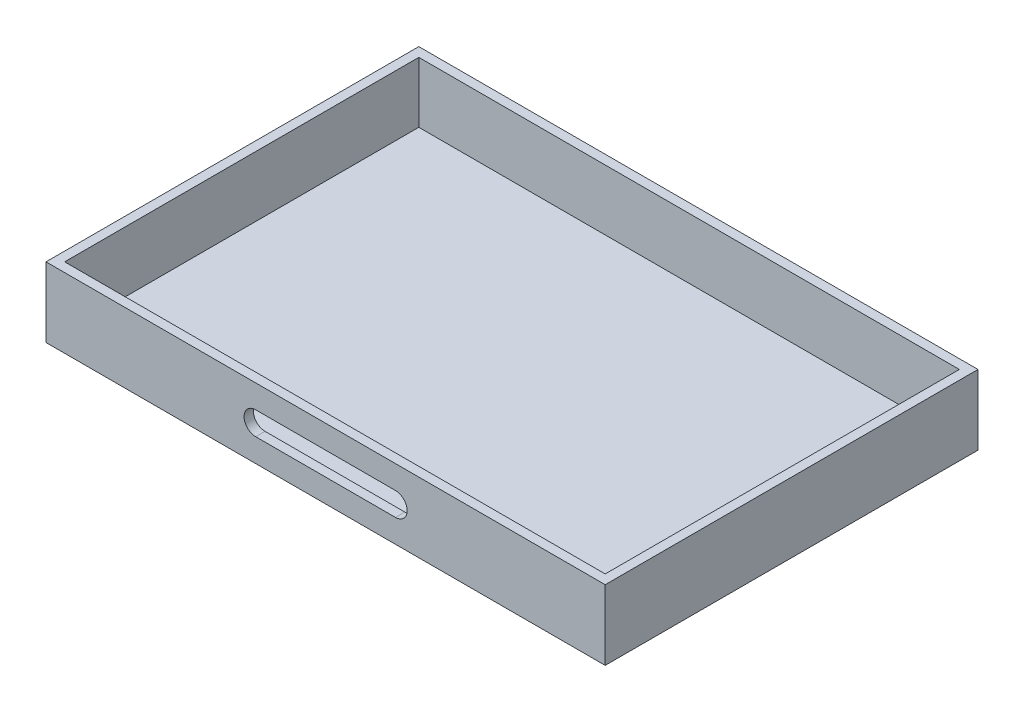
ISO-10303-21;
HEADER;
FILE_DESCRIPTION(('STEP AP214'),'2;1');
FILE_NAME('part.step','',(''),(''),'','','');
FILE_SCHEMA(('AUTOMOTIVE_DESIGN { 1 0 10303 214 1 1 1 1 }'));
ENDSEC;
DATA;
#1=APPLICATION_CONTEXT('core data for automotive mechanical design processes');
#2=APPLICATION_PROTOCOL_DEFINITION('international standard','automotive_design',2000,#1);
#3=PRODUCT_CONTEXT('',#1,'mechanical');
#4=PRODUCT('Part','Part','',(#3));
#5=PRODUCT_RELATED_PRODUCT_CATEGORY('part','',(#4));
#6=PRODUCT_DEFINITION_FORMATION('','',#4);
#7=PRODUCT_DEFINITION_CONTEXT('part definition',#1,'design');
#8=PRODUCT_DEFINITION('design','',#6,#7);
#9=PRODUCT_DEFINITION_SHAPE('','',#8);
#10=(LENGTH_UNIT() NAMED_UNIT(*) SI_UNIT(.MILLI.,.METRE.));
#11=(NAMED_UNIT(*) PLANE_ANGLE_UNIT() SI_UNIT($,.RADIAN.));
#12=(NAMED_UNIT(*) SI_UNIT($,.STERADIAN.) SOLID_ANGLE_UNIT());
#13=UNCERTAINTY_MEASURE_WITH_UNIT(LENGTH_MEASURE(1.E-05),#10,'distance_accuracy_value','');
#14=(GEOMETRIC_REPRESENTATION_CONTEXT(3) GLOBAL_UNCERTAINTY_ASSIGNED_CONTEXT((#13)) GLOBAL_UNIT_ASSIGNED_CONTEXT((#10,
#11,#12)) REPRESENTATION_CONTEXT('',''));
#15=CARTESIAN_POINT('',(0.,0.,0.));
#16=DIRECTION('',(0.,0.,1.));
#17=DIRECTION('',(1.,0.,0.));
#18=AXIS2_PLACEMENT_3D('',#15,#16,#17);
#19=CARTESIAN_POINT('',(60.,2.,40.));
#20=DIRECTION('',(-1.,0.,0.));
#21=DIRECTION('',(0.,0.,1.));
#22=AXIS2_PLACEMENT_3D('',#19,#20,#21);
#23=PLANE('',#22);
#24=DIRECTION('',(0.,0.,-1.));
#25=VECTOR('',#24,1.);
#26=CARTESIAN_POINT('',(60.,0.,40.));
#27=LINE('',#26,#25);
#28=CARTESIAN_POINT('',(60.,0.,40.));
#29=VERTEX_POINT('',#28);
#30=CARTESIAN_POINT('',(60.,0.,-40.));
#31=VERTEX_POINT('',#30);
#32=EDGE_CURVE('E230',#29,#31,#27,.T.);
#33=ORIENTED_EDGE('',*,*,#32,.T.);
#34=DIRECTION('',(0.,-1.,0.));
#35=VECTOR('',#34,1.);
#36=CARTESIAN_POINT('',(60.,2.,-40.));
#37=LINE('',#36,#35);
#38=CARTESIAN_POINT('',(60.,15.,-40.));
#39=VERTEX_POINT('',#38);
#40=EDGE_CURVE('E12',#39,#31,#37,.T.);
#41=ORIENTED_EDGE('',*,*,#40,.F.);
#42=DIRECTION('',(0.,0.,-1.));
#43=VECTOR('',#42,1.);
#44=CARTESIAN_POINT('',(60.,15.,0.));
#45=LINE('',#44,#43);
#46=CARTESIAN_POINT('',(60.,15.,40.));
#47=VERTEX_POINT('',#46);
#48=EDGE_CURVE('E218',#47,#39,#45,.T.);
#49=ORIENTED_EDGE('',*,*,#48,.F.);
#50=DIRECTION('',(0.,-1.,0.));
#51=VECTOR('',#50,1.);
#52=CARTESIAN_POINT('',(60.,2.,40.));
#53=LINE('',#52,#51);
#54=EDGE_CURVE('E239',#47,#29,#53,.T.);
#55=ORIENTED_EDGE('',*,*,#54,.T.);
#56=EDGE_LOOP('',(#33,#41,#49,#55));
#57=FACE_BOUND('',#56,.T.);
#58=ADVANCED_FACE('F63',(#57),#23,.F.);
#59=CARTESIAN_POINT('',(-60.,2.,-40.));
#60=DIRECTION('',(0.,0.,1.));
#61=DIRECTION('',(1.,0.,0.));
#62=AXIS2_PLACEMENT_3D('',#59,#60,#61);
#63=PLANE('',#62);
#64=DIRECTION('',(-1.,0.,0.));
#65=VECTOR('',#64,1.);
#66=CARTESIAN_POINT('',(-60.,0.,-40.));
#67=LINE('',#66,#65);
#68=CARTESIAN_POINT('',(-60.,0.,-40.));
#69=VERTEX_POINT('',#68);
#70=EDGE_CURVE('E233',#31,#69,#67,.T.);
#71=ORIENTED_EDGE('',*,*,#70,.T.);
#72=DIRECTION('',(0.,-1.,0.));
#73=VECTOR('',#72,1.);
#74=CARTESIAN_POINT('',(-60.,2.,-40.));
#75=LINE('',#74,#73);
#76=CARTESIAN_POINT('',(-60.,15.,-40.));
#77=VERTEX_POINT('',#76);
#78=EDGE_CURVE('E70',#77,#69,#75,.T.);
#79=ORIENTED_EDGE('',*,*,#78,.F.);
#80=DIRECTION('',(-1.,0.,0.));
#81=VECTOR('',#80,1.);
#82=CARTESIAN_POINT('',(0.,15.,-40.));
#83=LINE('',#82,#81);
#84=EDGE_CURVE('E221',#39,#77,#83,.T.);
#85=ORIENTED_EDGE('',*,*,#84,.F.);
#86=ORIENTED_EDGE('',*,*,#40,.T.);
#87=EDGE_LOOP('',(#71,#79,#85,#86));
#88=FACE_BOUND('',#87,.T.);
#89=ADVANCED_FACE('F263',(#88),#63,.F.);
#90=CARTESIAN_POINT('',(-60.,2.,40.));
#91=DIRECTION('',(1.,0.,0.));
#92=DIRECTION('',(0.,0.,-1.));
#93=AXIS2_PLACEMENT_3D('',#90,#91,#92);
#94=PLANE('',#93);
#95=DIRECTION('',(0.,0.,1.));
#96=VECTOR('',#95,1.);
#97=CARTESIAN_POINT('',(-60.,0.,40.));
#98=LINE('',#97,#96);
#99=CARTESIAN_POINT('',(-60.,0.,40.));
#100=VERTEX_POINT('',#99);
#101=EDGE_CURVE('E235',#69,#100,#98,.T.);
#102=ORIENTED_EDGE('',*,*,#101,.T.);
#103=DIRECTION('',(0.,-1.,0.));
#104=VECTOR('',#103,1.);
#105=CARTESIAN_POINT('',(-60.,2.,40.));
#106=LINE('',#105,#104);
#107=CARTESIAN_POINT('',(-60.,15.,40.));
#108=VERTEX_POINT('',#107);
#109=EDGE_CURVE('E242',#108,#100,#106,.T.);
#110=ORIENTED_EDGE('',*,*,#109,.F.);
#111=DIRECTION('',(0.,0.,1.));
#112=VECTOR('',#111,1.);
#113=CARTESIAN_POINT('',(-60.,15.,0.));
#114=LINE('',#113,#112);
#115=EDGE_CURVE('E224',#77,#108,#114,.T.);
#116=ORIENTED_EDGE('',*,*,#115,.F.);
#117=ORIENTED_EDGE('',*,*,#78,.T.);
#118=EDGE_LOOP('',(#102,#110,#116,#117));
#119=FACE_BOUND('',#118,.T.);
#120=ADVANCED_FACE('F248',(#119),#94,.F.);
#121=CARTESIAN_POINT('',(-60.,2.,40.));
#122=DIRECTION('',(0.,0.,-1.));
#123=DIRECTION('',(-1.,0.,0.));
#124=AXIS2_PLACEMENT_3D('',#121,#122,#123);
#125=PLANE('',#124);
#126=CARTESIAN_POINT('',(15.,7.50000000000001,40.));
#127=DIRECTION('',(0.,0.,1.));
#128=DIRECTION('',(1.,0.,0.));
#129=AXIS2_PLACEMENT_3D('',#126,#127,#128);
#130=CIRCLE('',#129,2.5);
#131=CARTESIAN_POINT('',(15.,5.00000000000002,40.));
#132=VERTEX_POINT('',#131);
#133=CARTESIAN_POINT('',(15.,10.,40.));
#134=VERTEX_POINT('',#133);
#135=EDGE_CURVE('E175',#132,#134,#130,.T.);
#136=ORIENTED_EDGE('',*,*,#135,.F.);
#137=DIRECTION('',(1.,0.,0.));
#138=VECTOR('',#137,1.);
#139=CARTESIAN_POINT('',(-15.,5.,40.));
#140=LINE('',#139,#138);
#141=CARTESIAN_POINT('',(-15.,5.,40.));
#142=VERTEX_POINT('',#141);
#143=EDGE_CURVE('E168',#142,#132,#140,.T.);
#144=ORIENTED_EDGE('',*,*,#143,.F.);
#145=CARTESIAN_POINT('',(-15.,7.5,40.));
#146=DIRECTION('',(0.,0.,1.));
#147=DIRECTION('',(1.,0.,0.));
#148=AXIS2_PLACEMENT_3D('',#145,#146,#147);
#149=CIRCLE('',#148,2.5);
#150=CARTESIAN_POINT('',(-15.,10.,40.));
#151=VERTEX_POINT('',#150);
#152=EDGE_CURVE('E179',#151,#142,#149,.T.);
#153=ORIENTED_EDGE('',*,*,#152,.F.);
#154=DIRECTION('',(-1.,0.,0.));
#155=VECTOR('',#154,1.);
#156=CARTESIAN_POINT('',(-15.,10.,40.));
#157=LINE('',#156,#155);
#158=EDGE_CURVE('E77',#134,#151,#157,.T.);
#159=ORIENTED_EDGE('',*,*,#158,.F.);
#160=EDGE_LOOP('',(#136,#144,#153,#159));
#161=FACE_BOUND('',#160,.T.);
#162=DIRECTION('',(1.,0.,0.));
#163=VECTOR('',#162,1.);
#164=CARTESIAN_POINT('',(-60.,0.,40.));
#165=LINE('',#164,#163);
#166=EDGE_CURVE('E237',#100,#29,#165,.T.);
#167=ORIENTED_EDGE('',*,*,#166,.T.);
#168=ORIENTED_EDGE('',*,*,#54,.F.);
#169=DIRECTION('',(1.,0.,0.));
#170=VECTOR('',#169,1.);
#171=CARTESIAN_POINT('',(0.,15.,40.));
#172=LINE('',#171,#170);
#173=EDGE_CURVE('E227',#108,#47,#172,.T.);
#174=ORIENTED_EDGE('',*,*,#173,.F.);
#175=ORIENTED_EDGE('',*,*,#109,.T.);
#176=EDGE_LOOP('',(#167,#168,#174,#175));
#177=FACE_BOUND('',#176,.T.);
#178=ADVANCED_FACE('F256',(#161,#177),#125,.F.);
#179=CARTESIAN_POINT('',(0.,0.,0.));
#180=DIRECTION('',(0.,-1.,0.));
#181=DIRECTION('',(0.,0.,-1.));
#182=AXIS2_PLACEMENT_3D('',#179,#180,#181);
#183=PLANE('',#182);
#184=ORIENTED_EDGE('',*,*,#32,.F.);
#185=ORIENTED_EDGE('',*,*,#166,.F.);
#186=ORIENTED_EDGE('',*,*,#101,.F.);
#187=ORIENTED_EDGE('',*,*,#70,.F.);
#188=EDGE_LOOP('',(#184,#185,#186,#187));
#189=FACE_BOUND('',#188,.T.);
#190=ADVANCED_FACE('F254',(#189),#183,.T.);
#191=CARTESIAN_POINT('',(0.,15.,0.));
#192=DIRECTION('',(0.,1.,0.));
#193=DIRECTION('',(0.,0.,1.));
#194=AXIS2_PLACEMENT_3D('',#191,#192,#193);
#195=PLANE('',#194);
#196=ORIENTED_EDGE('',*,*,#48,.T.);
#197=ORIENTED_EDGE('',*,*,#84,.T.);
#198=ORIENTED_EDGE('',*,*,#115,.T.);
#199=ORIENTED_EDGE('',*,*,#173,.T.);
#200=EDGE_LOOP('',(#196,#197,#198,#199));
#201=FACE_BOUND('',#200,.T.);
#202=DIRECTION('',(-1.,0.,0.));
#203=VECTOR('',#202,1.);
#204=CARTESIAN_POINT('',(-58.,15.,-38.));
#205=LINE('',#204,#203);
#206=CARTESIAN_POINT('',(58.,15.,-38.));
#207=VERTEX_POINT('',#206);
#208=CARTESIAN_POINT('',(-58.,15.,-38.));
#209=VERTEX_POINT('',#208);
#210=EDGE_CURVE('E191',#207,#209,#205,.T.);
#211=ORIENTED_EDGE('',*,*,#210,.F.);
#212=DIRECTION('',(0.,0.,-1.));
#213=VECTOR('',#212,1.);
#214=CARTESIAN_POINT('',(58.,15.,38.));
#215=LINE('',#214,#213);
#216=CARTESIAN_POINT('',(58.,15.,38.));
#217=VERTEX_POINT('',#216);
#218=EDGE_CURVE('E189',#217,#207,#215,.T.);
#219=ORIENTED_EDGE('',*,*,#218,.F.);
#220=DIRECTION('',(1.,0.,0.));
#221=VECTOR('',#220,1.);
#222=CARTESIAN_POINT('',(-58.,15.,38.));
#223=LINE('',#222,#221);
#224=CARTESIAN_POINT('',(-58.,15.,38.));
#225=VERTEX_POINT('',#224);
#226=EDGE_CURVE('E197',#225,#217,#223,.T.);
#227=ORIENTED_EDGE('',*,*,#226,.F.);
#228=DIRECTION('',(0.,0.,1.));
#229=VECTOR('',#228,1.);
#230=CARTESIAN_POINT('',(-58.,15.,38.));
#231=LINE('',#230,#229);
#232=EDGE_CURVE('E194',#209,#225,#231,.T.);
#233=ORIENTED_EDGE('',*,*,#232,.F.);
#234=EDGE_LOOP('',(#211,#219,#227,#233));
#235=FACE_BOUND('',#234,.T.);
#236=ADVANCED_FACE('F261',(#201,#235),#195,.T.);
#237=CARTESIAN_POINT('',(58.,15.,38.));
#238=DIRECTION('',(-1.,0.,0.));
#239=DIRECTION('',(0.,0.,1.));
#240=AXIS2_PLACEMENT_3D('',#237,#238,#239);
#241=PLANE('',#240);
#242=DIRECTION('',(0.,0.,-1.));
#243=VECTOR('',#242,1.);
#244=CARTESIAN_POINT('',(58.,2.,38.));
#245=LINE('',#244,#243);
#246=CARTESIAN_POINT('',(58.,2.,38.));
#247=VERTEX_POINT('',#246);
#248=CARTESIAN_POINT('',(58.,2.,-38.));
#249=VERTEX_POINT('',#248);
#250=EDGE_CURVE('E188',#247,#249,#245,.T.);
#251=ORIENTED_EDGE('',*,*,#250,.F.);
#252=DIRECTION('',(0.,-1.,0.));
#253=VECTOR('',#252,1.);
#254=CARTESIAN_POINT('',(58.,15.,38.));
#255=LINE('',#254,#253);
#256=EDGE_CURVE('E199',#217,#247,#255,.T.);
#257=ORIENTED_EDGE('',*,*,#256,.F.);
#258=ORIENTED_EDGE('',*,*,#218,.T.);
#259=DIRECTION('',(0.,-1.,0.));
#260=VECTOR('',#259,1.);
#261=CARTESIAN_POINT('',(58.,15.,-38.));
#262=LINE('',#261,#260);
#263=EDGE_CURVE('E215',#207,#249,#262,.T.);
#264=ORIENTED_EDGE('',*,*,#263,.T.);
#265=EDGE_LOOP('',(#251,#257,#258,#264));
#266=FACE_BOUND('',#265,.T.);
#267=ADVANCED_FACE('F282',(#266),#241,.T.);
#268=CARTESIAN_POINT('',(-58.,15.,-38.));
#269=DIRECTION('',(0.,0.,1.));
#270=DIRECTION('',(1.,0.,0.));
#271=AXIS2_PLACEMENT_3D('',#268,#269,#270);
#272=PLANE('',#271);
#273=DIRECTION('',(-1.,0.,0.));
#274=VECTOR('',#273,1.);
#275=CARTESIAN_POINT('',(-58.,2.,-38.));
#276=LINE('',#275,#274);
#277=CARTESIAN_POINT('',(-58.,2.,-38.));
#278=VERTEX_POINT('',#277);
#279=EDGE_CURVE('E202',#249,#278,#276,.T.);
#280=ORIENTED_EDGE('',*,*,#279,.F.);
#281=ORIENTED_EDGE('',*,*,#263,.F.);
#282=ORIENTED_EDGE('',*,*,#210,.T.);
#283=DIRECTION('',(0.,-1.,0.));
#284=VECTOR('',#283,1.);
#285=CARTESIAN_POINT('',(-58.,15.,-38.));
#286=LINE('',#285,#284);
#287=EDGE_CURVE('E213',#209,#278,#286,.T.);
#288=ORIENTED_EDGE('',*,*,#287,.T.);
#289=EDGE_LOOP('',(#280,#281,#282,#288));
#290=FACE_BOUND('',#289,.T.);
#291=ADVANCED_FACE('F285',(#290),#272,.T.);
#292=CARTESIAN_POINT('',(-58.,15.,38.));
#293=DIRECTION('',(1.,0.,0.));
#294=DIRECTION('',(0.,0.,-1.));
#295=AXIS2_PLACEMENT_3D('',#292,#293,#294);
#296=PLANE('',#295);
#297=DIRECTION('',(0.,0.,1.));
#298=VECTOR('',#297,1.);
#299=CARTESIAN_POINT('',(-58.,2.,38.));
#300=LINE('',#299,#298);
#301=CARTESIAN_POINT('',(-58.,2.,38.));
#302=VERTEX_POINT('',#301);
#303=EDGE_CURVE('E205',#278,#302,#300,.T.);
#304=ORIENTED_EDGE('',*,*,#303,.F.);
#305=ORIENTED_EDGE('',*,*,#287,.F.);
#306=ORIENTED_EDGE('',*,*,#232,.T.);
#307=DIRECTION('',(0.,-1.,0.));
#308=VECTOR('',#307,1.);
#309=CARTESIAN_POINT('',(-58.,15.,38.));
#310=LINE('',#309,#308);
#311=EDGE_CURVE('E211',#225,#302,#310,.T.);
#312=ORIENTED_EDGE('',*,*,#311,.T.);
#313=EDGE_LOOP('',(#304,#305,#306,#312));
#314=FACE_BOUND('',#313,.T.);
#315=ADVANCED_FACE('F289',(#314),#296,.T.);
#316=CARTESIAN_POINT('',(-58.,15.,38.));
#317=DIRECTION('',(0.,0.,-1.));
#318=DIRECTION('',(-1.,0.,0.));
#319=AXIS2_PLACEMENT_3D('',#316,#317,#318);
#320=PLANE('',#319);
#321=DIRECTION('',(1.,0.,0.));
#322=VECTOR('',#321,1.);
#323=CARTESIAN_POINT('',(-15.,5.,38.));
#324=LINE('',#323,#322);
#325=CARTESIAN_POINT('',(-15.,5.,38.));
#326=VERTEX_POINT('',#325);
#327=CARTESIAN_POINT('',(15.,5.00000000000002,38.));
#328=VERTEX_POINT('',#327);
#329=EDGE_CURVE('E165',#326,#328,#324,.T.);
#330=ORIENTED_EDGE('',*,*,#329,.T.);
#331=CARTESIAN_POINT('',(15.,7.50000000000001,38.));
#332=DIRECTION('',(0.,0.,-1.));
#333=DIRECTION('',(-1.,0.,0.));
#334=AXIS2_PLACEMENT_3D('',#331,#332,#333);
#335=CIRCLE('',#334,2.5);
#336=CARTESIAN_POINT('',(15.,10.,38.));
#337=VERTEX_POINT('',#336);
#338=EDGE_CURVE('E152',#328,#337,#335,.F.);
#339=ORIENTED_EDGE('',*,*,#338,.T.);
#340=DIRECTION('',(-1.,0.,0.));
#341=VECTOR('',#340,1.);
#342=CARTESIAN_POINT('',(-15.,10.,38.));
#343=LINE('',#342,#341);
#344=CARTESIAN_POINT('',(-15.,10.,38.));
#345=VERTEX_POINT('',#344);
#346=EDGE_CURVE('E183',#337,#345,#343,.T.);
#347=ORIENTED_EDGE('',*,*,#346,.T.);
#348=CARTESIAN_POINT('',(-15.,7.5,38.));
#349=DIRECTION('',(0.,0.,-1.));
#350=DIRECTION('',(-1.,0.,0.));
#351=AXIS2_PLACEMENT_3D('',#348,#349,#350);
#352=CIRCLE('',#351,2.5);
#353=EDGE_CURVE('E173',#345,#326,#352,.F.);
#354=ORIENTED_EDGE('',*,*,#353,.T.);
#355=EDGE_LOOP('',(#330,#339,#347,#354));
#356=FACE_BOUND('',#355,.T.);
#357=DIRECTION('',(1.,0.,0.));
#358=VECTOR('',#357,1.);
#359=CARTESIAN_POINT('',(-58.,2.,38.));
#360=LINE('',#359,#358);
#361=EDGE_CURVE('E192',#302,#247,#360,.T.);
#362=ORIENTED_EDGE('',*,*,#361,.F.);
#363=ORIENTED_EDGE('',*,*,#311,.F.);
#364=ORIENTED_EDGE('',*,*,#226,.T.);
#365=ORIENTED_EDGE('',*,*,#256,.T.);
#366=EDGE_LOOP('',(#362,#363,#364,#365));
#367=FACE_BOUND('',#366,.T.);
#368=ADVANCED_FACE('F171',(#356,#367),#320,.T.);
#369=CARTESIAN_POINT('',(0.,2.,0.));
#370=DIRECTION('',(0.,-1.,0.));
#371=DIRECTION('',(0.,0.,-1.));
#372=AXIS2_PLACEMENT_3D('',#369,#370,#371);
#373=PLANE('',#372);
#374=ORIENTED_EDGE('',*,*,#361,.T.);
#375=ORIENTED_EDGE('',*,*,#250,.T.);
#376=ORIENTED_EDGE('',*,*,#279,.T.);
#377=ORIENTED_EDGE('',*,*,#303,.T.);
#378=EDGE_LOOP('',(#374,#375,#376,#377));
#379=FACE_BOUND('',#378,.T.);
#380=ADVANCED_FACE('F276',(#379),#373,.F.);
#381=CARTESIAN_POINT('',(-15.,5.,2.64466094067263));
#382=DIRECTION('',(0.,-1.,0.));
#383=DIRECTION('',(0.,0.,-1.));
#384=AXIS2_PLACEMENT_3D('',#381,#382,#383);
#385=PLANE('',#384);
#386=DIRECTION('',(0.,0.,1.));
#387=VECTOR('',#386,1.);
#388=CARTESIAN_POINT('',(-15.,5.,2.64466094067263));
#389=LINE('',#388,#387);
#390=EDGE_CURVE('E85',#326,#142,#389,.T.);
#391=ORIENTED_EDGE('',*,*,#390,.T.);
#392=ORIENTED_EDGE('',*,*,#143,.T.);
#393=DIRECTION('',(0.,0.,1.));
#394=VECTOR('',#393,1.);
#395=CARTESIAN_POINT('',(15.,5.00000000000002,2.64466094067263));
#396=LINE('',#395,#394);
#397=EDGE_CURVE('E156',#328,#132,#396,.T.);
#398=ORIENTED_EDGE('',*,*,#397,.F.);
#399=ORIENTED_EDGE('',*,*,#329,.F.);
#400=EDGE_LOOP('',(#391,#392,#398,#399));
#401=FACE_BOUND('',#400,.T.);
#402=ADVANCED_FACE('F164',(#401),#385,.F.);
#403=CARTESIAN_POINT('',(15.,7.50000000000001,2.64466094067263));
#404=DIRECTION('',(0.,0.,1.));
#405=DIRECTION('',(1.,0.,0.));
#406=AXIS2_PLACEMENT_3D('',#403,#404,#405);
#407=CYLINDRICAL_SURFACE('',#406,2.5);
#408=ORIENTED_EDGE('',*,*,#397,.T.);
#409=ORIENTED_EDGE('',*,*,#135,.T.);
#410=DIRECTION('',(0.,0.,1.));
#411=VECTOR('',#410,1.);
#412=CARTESIAN_POINT('',(15.,10.,2.64466094067263));
#413=LINE('',#412,#411);
#414=EDGE_CURVE('E158',#337,#134,#413,.T.);
#415=ORIENTED_EDGE('',*,*,#414,.F.);
#416=ORIENTED_EDGE('',*,*,#338,.F.);
#417=EDGE_LOOP('',(#408,#409,#415,#416));
#418=FACE_BOUND('',#417,.T.);
#419=ADVANCED_FACE('F154',(#418),#407,.F.);
#420=CARTESIAN_POINT('',(-15.,10.,2.64466094067263));
#421=DIRECTION('',(0.,1.,0.));
#422=DIRECTION('',(-1.,0.,0.));
#423=AXIS2_PLACEMENT_3D('',#420,#421,#422);
#424=PLANE('',#423);
#425=ORIENTED_EDGE('',*,*,#414,.T.);
#426=ORIENTED_EDGE('',*,*,#158,.T.);
#427=DIRECTION('',(0.,0.,1.));
#428=VECTOR('',#427,1.);
#429=CARTESIAN_POINT('',(-15.,10.,2.64466094067263));
#430=LINE('',#429,#428);
#431=EDGE_CURVE('E182',#345,#151,#430,.T.);
#432=ORIENTED_EDGE('',*,*,#431,.F.);
#433=ORIENTED_EDGE('',*,*,#346,.F.);
#434=EDGE_LOOP('',(#425,#426,#432,#433));
#435=FACE_BOUND('',#434,.T.);
#436=ADVANCED_FACE('F300',(#435),#424,.F.);
#437=CARTESIAN_POINT('',(-15.,7.5,2.64466094067263));
#438=DIRECTION('',(0.,0.,1.));
#439=DIRECTION('',(1.,0.,0.));
#440=AXIS2_PLACEMENT_3D('',#437,#438,#439);
#441=CYLINDRICAL_SURFACE('',#440,2.5);
#442=ORIENTED_EDGE('',*,*,#431,.T.);
#443=ORIENTED_EDGE('',*,*,#152,.T.);
#444=ORIENTED_EDGE('',*,*,#390,.F.);
#445=ORIENTED_EDGE('',*,*,#353,.F.);
#446=EDGE_LOOP('',(#442,#443,#444,#445));
#447=FACE_BOUND('',#446,.T.);
#448=ADVANCED_FACE('F303',(#447),#441,.F.);
#449=CLOSED_SHELL('',(#58,#89,#120,#178,#190,#236,#267,#291,#315,#368,#380,#402,#419,#436,#448));
#450=MANIFOLD_SOLID_BREP('B2',#449);
#451=ADVANCED_BREP_SHAPE_REPRESENTATION('',(#18,#450),#14);
#452=SHAPE_DEFINITION_REPRESENTATION(#9,#451);
ENDSEC;
END-ISO-10303-21;
